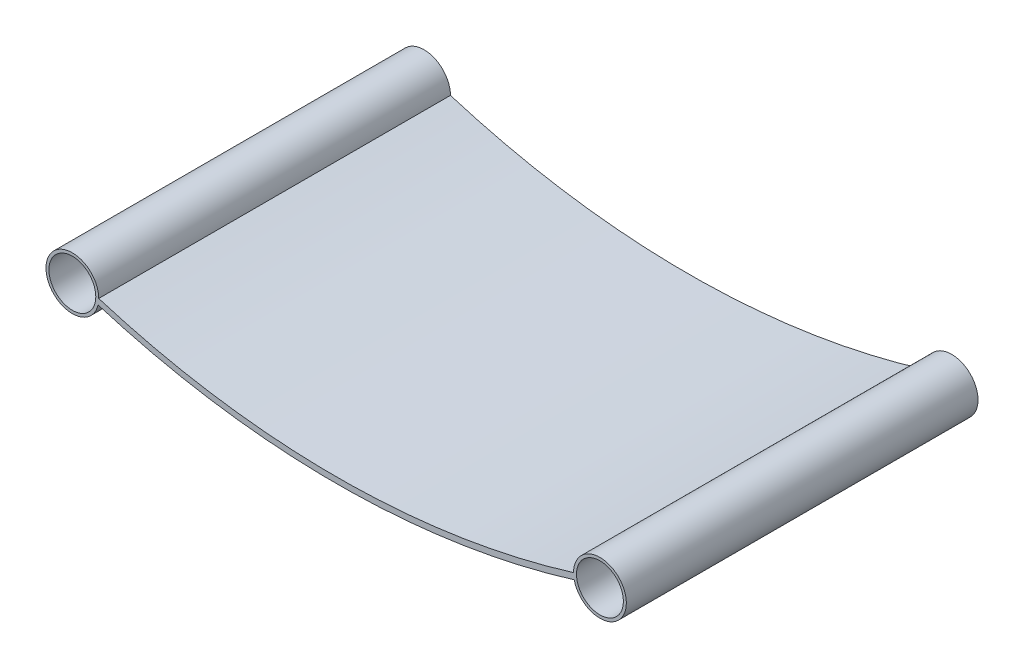
ISO-10303-21;
HEADER;
FILE_DESCRIPTION(('STEP AP214'),'2;1');
FILE_NAME('part.step','',(''),(''),'','','');
FILE_SCHEMA(('AUTOMOTIVE_DESIGN { 1 0 10303 214 1 1 1 1 }'));
ENDSEC;
DATA;
#1=APPLICATION_CONTEXT('core data for automotive mechanical design processes');
#2=APPLICATION_PROTOCOL_DEFINITION('international standard','automotive_design',2000,#1);
#3=PRODUCT_CONTEXT('',#1,'mechanical');
#4=PRODUCT('Part','Part','',(#3));
#5=PRODUCT_RELATED_PRODUCT_CATEGORY('part','',(#4));
#6=PRODUCT_DEFINITION_FORMATION('','',#4);
#7=PRODUCT_DEFINITION_CONTEXT('part definition',#1,'design');
#8=PRODUCT_DEFINITION('design','',#6,#7);
#9=PRODUCT_DEFINITION_SHAPE('','',#8);
#10=(LENGTH_UNIT() NAMED_UNIT(*) SI_UNIT(.MILLI.,.METRE.));
#11=(NAMED_UNIT(*) PLANE_ANGLE_UNIT() SI_UNIT($,.RADIAN.));
#12=(NAMED_UNIT(*) SI_UNIT($,.STERADIAN.) SOLID_ANGLE_UNIT());
#13=UNCERTAINTY_MEASURE_WITH_UNIT(LENGTH_MEASURE(1.E-05),#10,'distance_accuracy_value','');
#14=(GEOMETRIC_REPRESENTATION_CONTEXT(3) GLOBAL_UNCERTAINTY_ASSIGNED_CONTEXT((#13)) GLOBAL_UNIT_ASSIGNED_CONTEXT((#10,
#11,#12)) REPRESENTATION_CONTEXT('',''));
#15=CARTESIAN_POINT('',(0.,0.,0.));
#16=DIRECTION('',(0.,0.,1.));
#17=DIRECTION('',(1.,0.,0.));
#18=AXIS2_PLACEMENT_3D('',#15,#16,#17);
#19=CARTESIAN_POINT('',(-45.,0.,-60.));
#20=DIRECTION('',(0.,0.,1.));
#21=DIRECTION('',(1.,0.,0.));
#22=AXIS2_PLACEMENT_3D('',#19,#20,#21);
#23=CYLINDRICAL_SURFACE('',#22,4.5);
#24=DIRECTION('',(0.,0.,1.));
#25=VECTOR('',#24,1.);
#26=CARTESIAN_POINT('',(-40.6149690929022,-1.01069478270974,-30.));
#27=LINE('',#26,#25);
#28=CARTESIAN_POINT('',(-40.6149690929022,-1.01069478270974,0.));
#29=VERTEX_POINT('',#28);
#30=CARTESIAN_POINT('',(-40.6149690929022,-1.01069478270974,-60.));
#31=VERTEX_POINT('',#30);
#32=EDGE_CURVE('E64',#29,#31,#27,.F.);
#33=ORIENTED_EDGE('',*,*,#32,.F.);
#34=CARTESIAN_POINT('',(-45.,0.,0.));
#35=DIRECTION('',(0.,0.,1.));
#36=DIRECTION('',(1.,0.,0.));
#37=AXIS2_PLACEMENT_3D('',#34,#35,#36);
#38=CIRCLE('',#37,4.5);
#39=CARTESIAN_POINT('',(-40.5,0.,0.));
#40=VERTEX_POINT('',#39);
#41=EDGE_CURVE('E118',#40,#29,#38,.T.);
#42=ORIENTED_EDGE('',*,*,#41,.F.);
#43=DIRECTION('',(0.,0.,1.));
#44=VECTOR('',#43,1.);
#45=CARTESIAN_POINT('',(-40.5,0.,-60.));
#46=LINE('',#45,#44);
#47=CARTESIAN_POINT('',(-40.5,0.,-60.));
#48=VERTEX_POINT('',#47);
#49=EDGE_CURVE('E91',#48,#40,#46,.T.);
#50=ORIENTED_EDGE('',*,*,#49,.F.);
#51=CARTESIAN_POINT('',(-45.,0.,-60.));
#52=DIRECTION('',(0.,0.,1.));
#53=DIRECTION('',(1.,0.,0.));
#54=AXIS2_PLACEMENT_3D('',#51,#52,#53);
#55=CIRCLE('',#54,4.5);
#56=EDGE_CURVE('E49',#48,#31,#55,.T.);
#57=ORIENTED_EDGE('',*,*,#56,.T.);
#58=EDGE_LOOP('',(#33,#42,#50,#57));
#59=FACE_BOUND('',#58,.T.);
#60=ADVANCED_FACE('F42',(#59),#23,.T.);
#61=CARTESIAN_POINT('',(-45.,0.,-60.));
#62=DIRECTION('',(0.,0.,1.));
#63=DIRECTION('',(1.,0.,0.));
#64=AXIS2_PLACEMENT_3D('',#61,#62,#63);
#65=PLANE('',#64);
#66=CARTESIAN_POINT('',(0.,131.781359715146,-60.));
#67=DIRECTION('',(0.,0.,-1.));
#68=DIRECTION('',(-1.,0.,0.));
#69=AXIS2_PLACEMENT_3D('',#66,#67,#68);
#70=CIRCLE('',#69,137.864341903092);
#71=CARTESIAN_POINT('',(40.5,0.,-60.));
#72=VERTEX_POINT('',#71);
#73=EDGE_CURVE('E104',#72,#48,#70,.T.);
#74=ORIENTED_EDGE('',*,*,#73,.F.);
#75=CARTESIAN_POINT('',(45.,0.,-60.));
#76=DIRECTION('',(0.,0.,1.));
#77=DIRECTION('',(1.,0.,0.));
#78=AXIS2_PLACEMENT_3D('',#75,#76,#77);
#79=CIRCLE('',#78,4.5);
#80=CARTESIAN_POINT('',(40.6149690929022,-1.01069478270973,-60.));
#81=VERTEX_POINT('',#80);
#82=EDGE_CURVE('E88',#81,#72,#79,.T.);
#83=ORIENTED_EDGE('',*,*,#82,.F.);
#84=CARTESIAN_POINT('',(0.,131.781359715146,-60.));
#85=DIRECTION('',(0.,0.,1.));
#86=DIRECTION('',(-1.,0.,0.));
#87=AXIS2_PLACEMENT_3D('',#84,#85,#86);
#88=CIRCLE('',#87,138.864341903092);
#89=EDGE_CURVE('E109',#31,#81,#88,.T.);
#90=ORIENTED_EDGE('',*,*,#89,.F.);
#91=ORIENTED_EDGE('',*,*,#56,.F.);
#92=EDGE_LOOP('',(#74,#83,#90,#91));
#93=FACE_BOUND('',#92,.T.);
#94=CARTESIAN_POINT('',(-45.,0.,-60.));
#95=DIRECTION('',(0.,0.,1.));
#96=DIRECTION('',(1.,0.,0.));
#97=AXIS2_PLACEMENT_3D('',#94,#95,#96);
#98=CIRCLE('',#97,4.);
#99=CARTESIAN_POINT('',(-41.,0.,-60.));
#100=VERTEX_POINT('',#99);
#101=EDGE_CURVE('E115',#100,#100,#98,.T.);
#102=ORIENTED_EDGE('',*,*,#101,.T.);
#103=EDGE_LOOP('',(#102));
#104=FACE_BOUND('',#103,.T.);
#105=CARTESIAN_POINT('',(45.,0.,-60.));
#106=DIRECTION('',(0.,0.,1.));
#107=DIRECTION('',(1.,0.,0.));
#108=AXIS2_PLACEMENT_3D('',#105,#106,#107);
#109=CIRCLE('',#108,4.);
#110=CARTESIAN_POINT('',(49.,0.,-60.));
#111=VERTEX_POINT('',#110);
#112=EDGE_CURVE('E97',#111,#111,#109,.T.);
#113=ORIENTED_EDGE('',*,*,#112,.T.);
#114=EDGE_LOOP('',(#113));
#115=FACE_BOUND('',#114,.T.);
#116=ADVANCED_FACE('F125',(#93,#104,#115),#65,.F.);
#117=CARTESIAN_POINT('',(-45.,0.,0.));
#118=DIRECTION('',(0.,0.,1.));
#119=DIRECTION('',(1.,0.,0.));
#120=AXIS2_PLACEMENT_3D('',#117,#118,#119);
#121=PLANE('',#120);
#122=CARTESIAN_POINT('',(0.,131.781359715146,0.));
#123=DIRECTION('',(0.,0.,1.));
#124=DIRECTION('',(-1.,0.,0.));
#125=AXIS2_PLACEMENT_3D('',#122,#123,#124);
#126=CIRCLE('',#125,138.864341903092);
#127=CARTESIAN_POINT('',(40.6149690929022,-1.01069478270973,0.));
#128=VERTEX_POINT('',#127);
#129=EDGE_CURVE('E96',#29,#128,#126,.T.);
#130=ORIENTED_EDGE('',*,*,#129,.T.);
#131=CARTESIAN_POINT('',(45.,0.,0.));
#132=DIRECTION('',(0.,0.,1.));
#133=DIRECTION('',(1.,0.,0.));
#134=AXIS2_PLACEMENT_3D('',#131,#132,#133);
#135=CIRCLE('',#134,4.5);
#136=CARTESIAN_POINT('',(40.5,0.,0.));
#137=VERTEX_POINT('',#136);
#138=EDGE_CURVE('E85',#128,#137,#135,.T.);
#139=ORIENTED_EDGE('',*,*,#138,.T.);
#140=CARTESIAN_POINT('',(0.,131.781359715146,0.));
#141=DIRECTION('',(0.,0.,-1.));
#142=DIRECTION('',(-1.,0.,0.));
#143=AXIS2_PLACEMENT_3D('',#140,#141,#142);
#144=CIRCLE('',#143,137.864341903092);
#145=EDGE_CURVE('E56',#137,#40,#144,.T.);
#146=ORIENTED_EDGE('',*,*,#145,.T.);
#147=ORIENTED_EDGE('',*,*,#41,.T.);
#148=EDGE_LOOP('',(#130,#139,#146,#147));
#149=FACE_BOUND('',#148,.T.);
#150=CARTESIAN_POINT('',(-45.,0.,0.));
#151=DIRECTION('',(0.,0.,1.));
#152=DIRECTION('',(1.,0.,0.));
#153=AXIS2_PLACEMENT_3D('',#150,#151,#152);
#154=CIRCLE('',#153,4.);
#155=CARTESIAN_POINT('',(-41.,0.,0.));
#156=VERTEX_POINT('',#155);
#157=EDGE_CURVE('E114',#156,#156,#154,.T.);
#158=ORIENTED_EDGE('',*,*,#157,.F.);
#159=EDGE_LOOP('',(#158));
#160=FACE_BOUND('',#159,.T.);
#161=CARTESIAN_POINT('',(45.,0.,0.));
#162=DIRECTION('',(0.,0.,1.));
#163=DIRECTION('',(1.,0.,0.));
#164=AXIS2_PLACEMENT_3D('',#161,#162,#163);
#165=CIRCLE('',#164,4.);
#166=CARTESIAN_POINT('',(49.,0.,0.));
#167=VERTEX_POINT('',#166);
#168=EDGE_CURVE('E102',#167,#167,#165,.T.);
#169=ORIENTED_EDGE('',*,*,#168,.F.);
#170=EDGE_LOOP('',(#169));
#171=FACE_BOUND('',#170,.T.);
#172=ADVANCED_FACE('F94',(#149,#160,#171),#121,.T.);
#173=CARTESIAN_POINT('',(-45.,0.,-60.));
#174=DIRECTION('',(0.,0.,1.));
#175=DIRECTION('',(1.,0.,0.));
#176=AXIS2_PLACEMENT_3D('',#173,#174,#175);
#177=CYLINDRICAL_SURFACE('',#176,4.);
#178=ORIENTED_EDGE('',*,*,#101,.F.);
#179=EDGE_LOOP('',(#178));
#180=FACE_BOUND('',#179,.T.);
#181=ORIENTED_EDGE('',*,*,#157,.T.);
#182=EDGE_LOOP('',(#181));
#183=FACE_BOUND('',#182,.T.);
#184=ADVANCED_FACE('F140',(#180,#183),#177,.F.);
#185=CARTESIAN_POINT('',(0.,131.781359715146,-60.));
#186=DIRECTION('',(0.,0.,1.));
#187=DIRECTION('',(1.,0.,0.));
#188=AXIS2_PLACEMENT_3D('',#185,#186,#187);
#189=CYLINDRICAL_SURFACE('',#188,137.864341903092);
#190=ORIENTED_EDGE('',*,*,#145,.F.);
#191=DIRECTION('',(0.,0.,1.));
#192=VECTOR('',#191,1.);
#193=CARTESIAN_POINT('',(40.5,0.,-60.));
#194=LINE('',#193,#192);
#195=EDGE_CURVE('E83',#72,#137,#194,.T.);
#196=ORIENTED_EDGE('',*,*,#195,.F.);
#197=ORIENTED_EDGE('',*,*,#73,.T.);
#198=ORIENTED_EDGE('',*,*,#49,.T.);
#199=EDGE_LOOP('',(#190,#196,#197,#198));
#200=FACE_BOUND('',#199,.T.);
#201=ADVANCED_FACE('F99',(#200),#189,.F.);
#202=CARTESIAN_POINT('',(0.,131.781359715146,-60.));
#203=DIRECTION('',(0.,0.,1.));
#204=DIRECTION('',(1.,0.,0.));
#205=AXIS2_PLACEMENT_3D('',#202,#203,#204);
#206=CYLINDRICAL_SURFACE('',#205,138.864341903092);
#207=DIRECTION('',(0.,0.,1.));
#208=VECTOR('',#207,1.);
#209=CARTESIAN_POINT('',(40.6149690929022,-1.01069478270973,-30.));
#210=LINE('',#209,#208);
#211=EDGE_CURVE('E11',#128,#81,#210,.F.);
#212=ORIENTED_EDGE('',*,*,#211,.F.);
#213=ORIENTED_EDGE('',*,*,#129,.F.);
#214=ORIENTED_EDGE('',*,*,#32,.T.);
#215=ORIENTED_EDGE('',*,*,#89,.T.);
#216=EDGE_LOOP('',(#212,#213,#214,#215));
#217=FACE_BOUND('',#216,.T.);
#218=ADVANCED_FACE('F172',(#217),#206,.T.);
#219=CARTESIAN_POINT('',(45.,0.,-60.));
#220=DIRECTION('',(0.,0.,1.));
#221=DIRECTION('',(1.,0.,0.));
#222=AXIS2_PLACEMENT_3D('',#219,#220,#221);
#223=CYLINDRICAL_SURFACE('',#222,4.5);
#224=ORIENTED_EDGE('',*,*,#82,.T.);
#225=ORIENTED_EDGE('',*,*,#195,.T.);
#226=ORIENTED_EDGE('',*,*,#138,.F.);
#227=ORIENTED_EDGE('',*,*,#211,.T.);
#228=EDGE_LOOP('',(#224,#225,#226,#227));
#229=FACE_BOUND('',#228,.T.);
#230=ADVANCED_FACE('F84',(#229),#223,.T.);
#231=CARTESIAN_POINT('',(45.,0.,-60.));
#232=DIRECTION('',(0.,0.,1.));
#233=DIRECTION('',(1.,0.,0.));
#234=AXIS2_PLACEMENT_3D('',#231,#232,#233);
#235=CYLINDRICAL_SURFACE('',#234,4.);
#236=ORIENTED_EDGE('',*,*,#112,.F.);
#237=EDGE_LOOP('',(#236));
#238=FACE_BOUND('',#237,.T.);
#239=ORIENTED_EDGE('',*,*,#168,.T.);
#240=EDGE_LOOP('',(#239));
#241=FACE_BOUND('',#240,.T.);
#242=ADVANCED_FACE('F133',(#238,#241),#235,.F.);
#243=CLOSED_SHELL('',(#60,#116,#172,#184,#201,#218,#230,#242));
#244=MANIFOLD_SOLID_BREP('B2',#243);
#245=ADVANCED_BREP_SHAPE_REPRESENTATION('',(#18,#244),#14);
#246=SHAPE_DEFINITION_REPRESENTATION(#9,#245);
ENDSEC;
END-ISO-10303-21;
